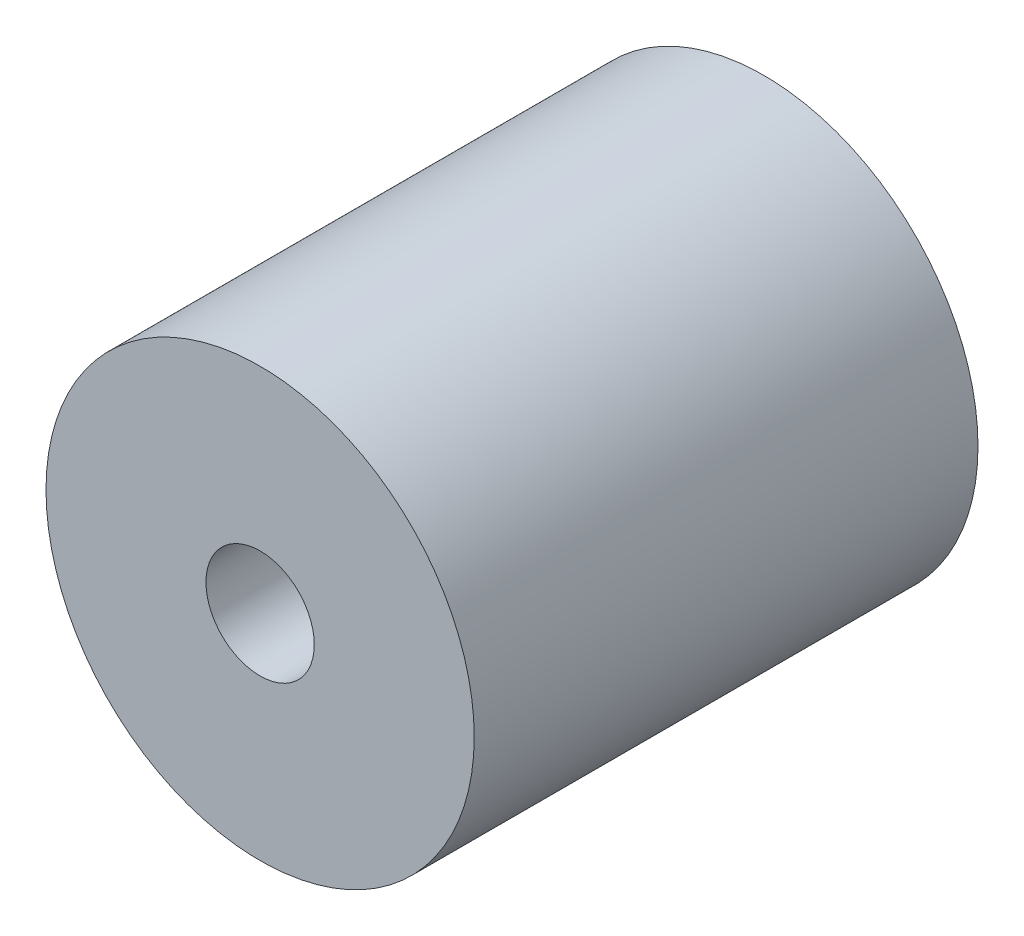
ISO-10303-21;
HEADER;
FILE_DESCRIPTION(('STEP AP214'),'2;1');
FILE_NAME('part.step','',(''),(''),'','','');
FILE_SCHEMA(('AUTOMOTIVE_DESIGN { 1 0 10303 214 1 1 1 1 }'));
ENDSEC;
DATA;
#1=APPLICATION_CONTEXT('core data for automotive mechanical design processes');
#2=APPLICATION_PROTOCOL_DEFINITION('international standard','automotive_design',2000,#1);
#3=PRODUCT_CONTEXT('',#1,'mechanical');
#4=PRODUCT('Part','Part','',(#3));
#5=PRODUCT_RELATED_PRODUCT_CATEGORY('part','',(#4));
#6=PRODUCT_DEFINITION_FORMATION('','',#4);
#7=PRODUCT_DEFINITION_CONTEXT('part definition',#1,'design');
#8=PRODUCT_DEFINITION('design','',#6,#7);
#9=PRODUCT_DEFINITION_SHAPE('','',#8);
#10=(LENGTH_UNIT() NAMED_UNIT(*) SI_UNIT(.MILLI.,.METRE.));
#11=(NAMED_UNIT(*) PLANE_ANGLE_UNIT() SI_UNIT($,.RADIAN.));
#12=(NAMED_UNIT(*) SI_UNIT($,.STERADIAN.) SOLID_ANGLE_UNIT());
#13=UNCERTAINTY_MEASURE_WITH_UNIT(LENGTH_MEASURE(1.E-05),#10,'distance_accuracy_value','');
#14=(GEOMETRIC_REPRESENTATION_CONTEXT(3) GLOBAL_UNCERTAINTY_ASSIGNED_CONTEXT((#13)) GLOBAL_UNIT_ASSIGNED_CONTEXT((#10,
#11,#12)) REPRESENTATION_CONTEXT('',''));
#15=CARTESIAN_POINT('',(0.,0.,0.));
#16=DIRECTION('',(0.,0.,1.));
#17=DIRECTION('',(1.,0.,0.));
#18=AXIS2_PLACEMENT_3D('',#15,#16,#17);
#19=CARTESIAN_POINT('',(0.,0.,10.));
#20=DIRECTION('',(0.,0.,-1.));
#21=DIRECTION('',(-1.,0.,0.));
#22=AXIS2_PLACEMENT_3D('',#19,#20,#21);
#23=CYLINDRICAL_SURFACE('',#22,4.25);
#24=CARTESIAN_POINT('',(0.,0.,10.));
#25=DIRECTION('',(0.,0.,1.));
#26=DIRECTION('',(1.,0.,0.));
#27=AXIS2_PLACEMENT_3D('',#24,#25,#26);
#28=CIRCLE('',#27,4.25);
#29=CARTESIAN_POINT('',(4.25,0.,10.));
#30=VERTEX_POINT('',#29);
#31=EDGE_CURVE('E10',#30,#30,#28,.T.);
#32=ORIENTED_EDGE('',*,*,#31,.F.);
#33=EDGE_LOOP('',(#32));
#34=FACE_BOUND('',#33,.T.);
#35=CARTESIAN_POINT('',(0.,0.,0.));
#36=DIRECTION('',(0.,0.,1.));
#37=DIRECTION('',(1.,0.,0.));
#38=AXIS2_PLACEMENT_3D('',#35,#36,#37);
#39=CIRCLE('',#38,4.25);
#40=CARTESIAN_POINT('',(4.25,0.,0.));
#41=VERTEX_POINT('',#40);
#42=EDGE_CURVE('E34',#41,#41,#39,.T.);
#43=ORIENTED_EDGE('',*,*,#42,.T.);
#44=EDGE_LOOP('',(#43));
#45=FACE_BOUND('',#44,.T.);
#46=ADVANCED_FACE('F31',(#34,#45),#23,.T.);
#47=CARTESIAN_POINT('',(0.,0.,10.));
#48=DIRECTION('',(0.,0.,1.));
#49=DIRECTION('',(1.,0.,0.));
#50=AXIS2_PLACEMENT_3D('',#47,#48,#49);
#51=PLANE('',#50);
#52=CARTESIAN_POINT('',(0.,0.,10.));
#53=DIRECTION('',(0.,0.,1.));
#54=DIRECTION('',(1.,0.,0.));
#55=AXIS2_PLACEMENT_3D('',#52,#53,#54);
#56=CIRCLE('',#55,1.075);
#57=CARTESIAN_POINT('',(1.075,0.,10.));
#58=VERTEX_POINT('',#57);
#59=EDGE_CURVE('E43',#58,#58,#56,.F.);
#60=ORIENTED_EDGE('',*,*,#59,.T.);
#61=EDGE_LOOP('',(#60));
#62=FACE_BOUND('',#61,.T.);
#63=ORIENTED_EDGE('',*,*,#31,.T.);
#64=EDGE_LOOP('',(#63));
#65=FACE_BOUND('',#64,.T.);
#66=ADVANCED_FACE('F54',(#62,#65),#51,.T.);
#67=CARTESIAN_POINT('',(0.,0.,0.));
#68=DIRECTION('',(0.,0.,1.));
#69=DIRECTION('',(1.,0.,0.));
#70=AXIS2_PLACEMENT_3D('',#67,#68,#69);
#71=PLANE('',#70);
#72=CARTESIAN_POINT('',(0.,0.,0.));
#73=DIRECTION('',(0.,0.,-1.));
#74=DIRECTION('',(-1.,0.,0.));
#75=AXIS2_PLACEMENT_3D('',#72,#73,#74);
#76=CIRCLE('',#75,1.075);
#77=CARTESIAN_POINT('',(-1.075,0.,0.));
#78=VERTEX_POINT('',#77);
#79=EDGE_CURVE('E41',#78,#78,#76,.T.);
#80=ORIENTED_EDGE('',*,*,#79,.F.);
#81=EDGE_LOOP('',(#80));
#82=FACE_BOUND('',#81,.T.);
#83=ORIENTED_EDGE('',*,*,#42,.F.);
#84=EDGE_LOOP('',(#83));
#85=FACE_BOUND('',#84,.T.);
#86=ADVANCED_FACE('F51',(#82,#85),#71,.F.);
#87=CARTESIAN_POINT('',(0.,0.,10.001));
#88=DIRECTION('',(0.,0.,-1.));
#89=DIRECTION('',(-1.,0.,0.));
#90=AXIS2_PLACEMENT_3D('',#87,#88,#89);
#91=CYLINDRICAL_SURFACE('',#90,1.075);
#92=ORIENTED_EDGE('',*,*,#59,.F.);
#93=EDGE_LOOP('',(#92));
#94=FACE_BOUND('',#93,.T.);
#95=ORIENTED_EDGE('',*,*,#79,.T.);
#96=EDGE_LOOP('',(#95));
#97=FACE_BOUND('',#96,.T.);
#98=ADVANCED_FACE('F49',(#94,#97),#91,.F.);
#99=CLOSED_SHELL('',(#46,#66,#86,#98));
#100=MANIFOLD_SOLID_BREP('B2',#99);
#101=ADVANCED_BREP_SHAPE_REPRESENTATION('',(#18,#100),#14);
#102=SHAPE_DEFINITION_REPRESENTATION(#9,#101);
ENDSEC;
END-ISO-10303-21;
